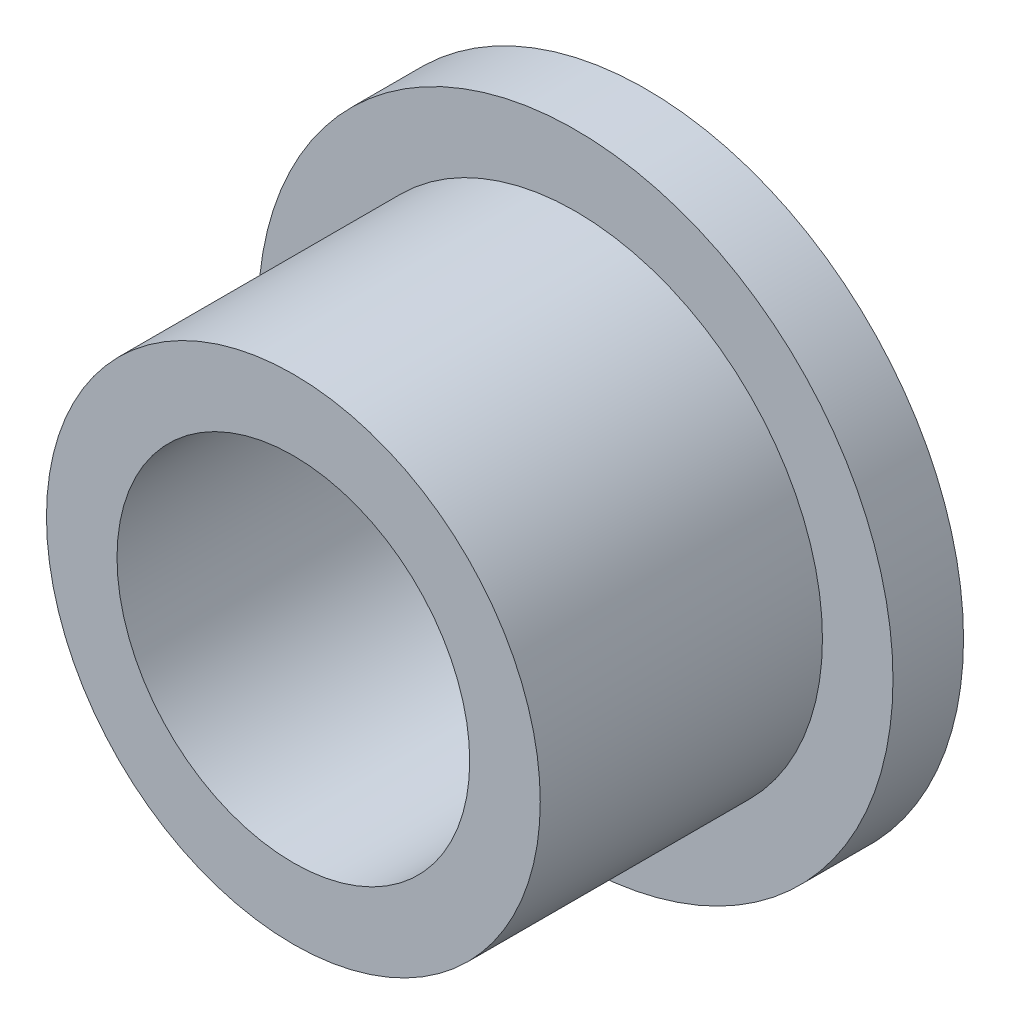
ISO-10303-21;
HEADER;
FILE_DESCRIPTION(('STEP AP214'),'2;1');
FILE_NAME('part.step','',(''),(''),'','','');
FILE_SCHEMA(('AUTOMOTIVE_DESIGN { 1 0 10303 214 1 1 1 1 }'));
ENDSEC;
DATA;
#1=APPLICATION_CONTEXT('core data for automotive mechanical design processes');
#2=APPLICATION_PROTOCOL_DEFINITION('international standard','automotive_design',2000,#1);
#3=PRODUCT_CONTEXT('',#1,'mechanical');
#4=PRODUCT('Part','Part','',(#3));
#5=PRODUCT_RELATED_PRODUCT_CATEGORY('part','',(#4));
#6=PRODUCT_DEFINITION_FORMATION('','',#4);
#7=PRODUCT_DEFINITION_CONTEXT('part definition',#1,'design');
#8=PRODUCT_DEFINITION('design','',#6,#7);
#9=PRODUCT_DEFINITION_SHAPE('','',#8);
#10=(LENGTH_UNIT() NAMED_UNIT(*) SI_UNIT(.MILLI.,.METRE.));
#11=(NAMED_UNIT(*) PLANE_ANGLE_UNIT() SI_UNIT($,.RADIAN.));
#12=(NAMED_UNIT(*) SI_UNIT($,.STERADIAN.) SOLID_ANGLE_UNIT());
#13=UNCERTAINTY_MEASURE_WITH_UNIT(LENGTH_MEASURE(1.E-05),#10,'distance_accuracy_value','');
#14=(GEOMETRIC_REPRESENTATION_CONTEXT(3) GLOBAL_UNCERTAINTY_ASSIGNED_CONTEXT((#13)) GLOBAL_UNIT_ASSIGNED_CONTEXT((#10,
#11,#12)) REPRESENTATION_CONTEXT('',''));
#15=CARTESIAN_POINT('',(0.,0.,0.));
#16=DIRECTION('',(0.,0.,1.));
#17=DIRECTION('',(1.,0.,0.));
#18=AXIS2_PLACEMENT_3D('',#15,#16,#17);
#19=CARTESIAN_POINT('',(0.,0.,20.));
#20=DIRECTION('',(0.,0.,-1.));
#21=DIRECTION('',(-1.,0.,0.));
#22=AXIS2_PLACEMENT_3D('',#19,#20,#21);
#23=CYLINDRICAL_SURFACE('',#22,12.5);
#24=CARTESIAN_POINT('',(0.,0.,20.));
#25=DIRECTION('',(0.,0.,1.));
#26=DIRECTION('',(1.,0.,0.));
#27=AXIS2_PLACEMENT_3D('',#24,#25,#26);
#28=CIRCLE('',#27,12.5);
#29=CARTESIAN_POINT('',(12.5,0.,20.));
#30=VERTEX_POINT('',#29);
#31=EDGE_CURVE('E42',#30,#30,#28,.T.);
#32=ORIENTED_EDGE('',*,*,#31,.T.);
#33=EDGE_LOOP('',(#32));
#34=FACE_BOUND('',#33,.T.);
#35=CARTESIAN_POINT('',(0.,0.,-5.));
#36=DIRECTION('',(0.,0.,1.));
#37=DIRECTION('',(1.,0.,0.));
#38=AXIS2_PLACEMENT_3D('',#35,#36,#37);
#39=CIRCLE('',#38,12.5);
#40=CARTESIAN_POINT('',(12.5,0.,-5.));
#41=VERTEX_POINT('',#40);
#42=EDGE_CURVE('E50',#41,#41,#39,.T.);
#43=ORIENTED_EDGE('',*,*,#42,.F.);
#44=EDGE_LOOP('',(#43));
#45=FACE_BOUND('',#44,.T.);
#46=ADVANCED_FACE('F36',(#34,#45),#23,.F.);
#47=CARTESIAN_POINT('',(0.,0.,20.));
#48=DIRECTION('',(0.,0.,-1.));
#49=DIRECTION('',(-1.,0.,0.));
#50=AXIS2_PLACEMENT_3D('',#47,#48,#49);
#51=CYLINDRICAL_SURFACE('',#50,17.5);
#52=CARTESIAN_POINT('',(0.,0.,20.));
#53=DIRECTION('',(0.,0.,1.));
#54=DIRECTION('',(1.,0.,0.));
#55=AXIS2_PLACEMENT_3D('',#52,#53,#54);
#56=CIRCLE('',#55,17.5);
#57=CARTESIAN_POINT('',(17.5,0.,20.));
#58=VERTEX_POINT('',#57);
#59=EDGE_CURVE('E10',#58,#58,#56,.T.);
#60=ORIENTED_EDGE('',*,*,#59,.F.);
#61=EDGE_LOOP('',(#60));
#62=FACE_BOUND('',#61,.T.);
#63=CARTESIAN_POINT('',(0.,0.,0.));
#64=DIRECTION('',(0.,0.,1.));
#65=DIRECTION('',(1.,0.,0.));
#66=AXIS2_PLACEMENT_3D('',#63,#64,#65);
#67=CIRCLE('',#66,17.5);
#68=CARTESIAN_POINT('',(17.5,0.,0.));
#69=VERTEX_POINT('',#68);
#70=EDGE_CURVE('E46',#69,#69,#67,.T.);
#71=ORIENTED_EDGE('',*,*,#70,.T.);
#72=EDGE_LOOP('',(#71));
#73=FACE_BOUND('',#72,.T.);
#74=ADVANCED_FACE('F72',(#62,#73),#51,.T.);
#75=CARTESIAN_POINT('',(0.,-49.6414213562373,20.));
#76=DIRECTION('',(0.,0.,1.));
#77=DIRECTION('',(1.,0.,0.));
#78=AXIS2_PLACEMENT_3D('',#75,#76,#77);
#79=PLANE('',#78);
#80=ORIENTED_EDGE('',*,*,#31,.F.);
#81=EDGE_LOOP('',(#80));
#82=FACE_BOUND('',#81,.T.);
#83=ORIENTED_EDGE('',*,*,#59,.T.);
#84=EDGE_LOOP('',(#83));
#85=FACE_BOUND('',#84,.T.);
#86=ADVANCED_FACE('F76',(#82,#85),#79,.T.);
#87=CARTESIAN_POINT('',(0.,-49.6414213562373,0.));
#88=DIRECTION('',(0.,0.,1.));
#89=DIRECTION('',(1.,0.,0.));
#90=AXIS2_PLACEMENT_3D('',#87,#88,#89);
#91=PLANE('',#90);
#92=CARTESIAN_POINT('',(0.,0.,0.));
#93=DIRECTION('',(0.,0.,1.));
#94=DIRECTION('',(1.,0.,0.));
#95=AXIS2_PLACEMENT_3D('',#92,#93,#94);
#96=CIRCLE('',#95,22.5);
#97=CARTESIAN_POINT('',(22.5,0.,0.));
#98=VERTEX_POINT('',#97);
#99=EDGE_CURVE('E53',#98,#98,#96,.T.);
#100=ORIENTED_EDGE('',*,*,#99,.T.);
#101=EDGE_LOOP('',(#100));
#102=FACE_BOUND('',#101,.T.);
#103=ORIENTED_EDGE('',*,*,#70,.F.);
#104=EDGE_LOOP('',(#103));
#105=FACE_BOUND('',#104,.T.);
#106=ADVANCED_FACE('F81',(#102,#105),#91,.T.);
#107=CARTESIAN_POINT('',(0.,0.,-5.));
#108=DIRECTION('',(0.,0.,1.));
#109=DIRECTION('',(1.,0.,0.));
#110=AXIS2_PLACEMENT_3D('',#107,#108,#109);
#111=CYLINDRICAL_SURFACE('',#110,22.5);
#112=CARTESIAN_POINT('',(0.,0.,-5.));
#113=DIRECTION('',(0.,0.,1.));
#114=DIRECTION('',(1.,0.,0.));
#115=AXIS2_PLACEMENT_3D('',#112,#113,#114);
#116=CIRCLE('',#115,22.5);
#117=CARTESIAN_POINT('',(22.5,0.,-5.));
#118=VERTEX_POINT('',#117);
#119=EDGE_CURVE('E56',#118,#118,#116,.T.);
#120=ORIENTED_EDGE('',*,*,#119,.T.);
#121=EDGE_LOOP('',(#120));
#122=FACE_BOUND('',#121,.T.);
#123=ORIENTED_EDGE('',*,*,#99,.F.);
#124=EDGE_LOOP('',(#123));
#125=FACE_BOUND('',#124,.T.);
#126=ADVANCED_FACE('F62',(#122,#125),#111,.T.);
#127=CARTESIAN_POINT('',(0.,-49.6414213562373,-5.));
#128=DIRECTION('',(0.,0.,1.));
#129=DIRECTION('',(1.,0.,0.));
#130=AXIS2_PLACEMENT_3D('',#127,#128,#129);
#131=PLANE('',#130);
#132=ORIENTED_EDGE('',*,*,#119,.F.);
#133=EDGE_LOOP('',(#132));
#134=FACE_BOUND('',#133,.T.);
#135=ORIENTED_EDGE('',*,*,#42,.T.);
#136=EDGE_LOOP('',(#135));
#137=FACE_BOUND('',#136,.T.);
#138=ADVANCED_FACE('F65',(#134,#137),#131,.F.);
#139=CLOSED_SHELL('',(#46,#74,#86,#106,#126,#138));
#140=MANIFOLD_SOLID_BREP('B2',#139);
#141=ADVANCED_BREP_SHAPE_REPRESENTATION('',(#18,#140),#14);
#142=SHAPE_DEFINITION_REPRESENTATION(#9,#141);
ENDSEC;
END-ISO-10303-21;
